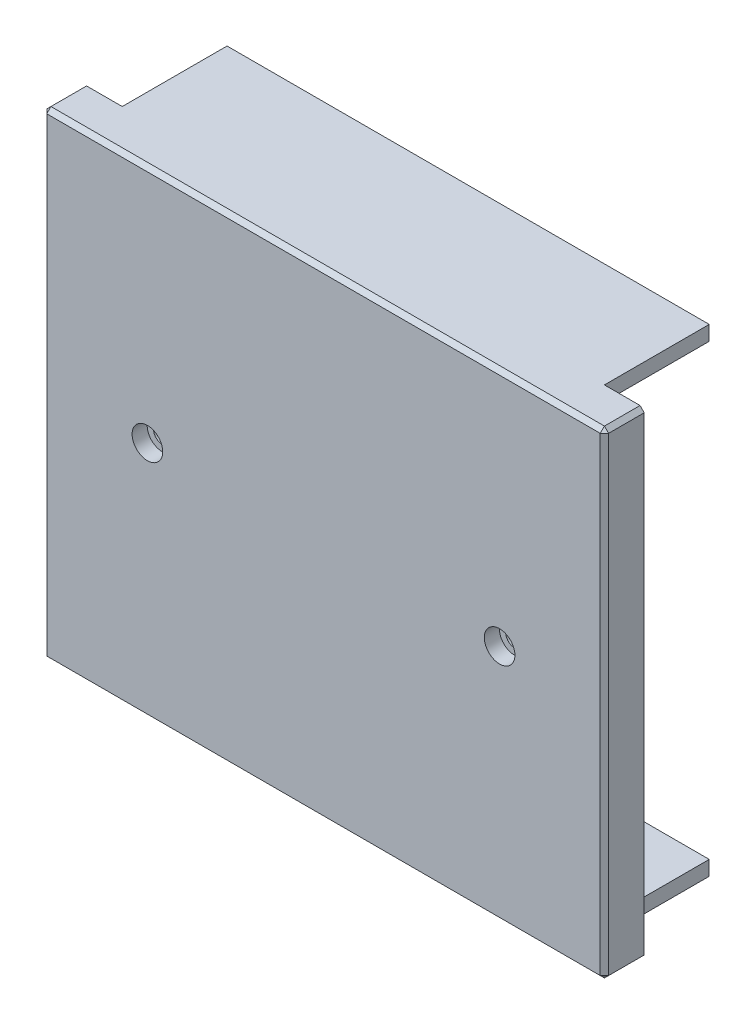
ISO-10303-21;
HEADER;
FILE_DESCRIPTION(('STEP AP214'),'2;1');
FILE_NAME('part.step','',(''),(''),'','','');
FILE_SCHEMA(('AUTOMOTIVE_DESIGN { 1 0 10303 214 1 1 1 1 }'));
ENDSEC;
DATA;
#1=APPLICATION_CONTEXT('core data for automotive mechanical design processes');
#2=APPLICATION_PROTOCOL_DEFINITION('international standard','automotive_design',2000,#1);
#3=PRODUCT_CONTEXT('',#1,'mechanical');
#4=PRODUCT('Part','Part','',(#3));
#5=PRODUCT_RELATED_PRODUCT_CATEGORY('part','',(#4));
#6=PRODUCT_DEFINITION_FORMATION('','',#4);
#7=PRODUCT_DEFINITION_CONTEXT('part definition',#1,'design');
#8=PRODUCT_DEFINITION('design','',#6,#7);
#9=PRODUCT_DEFINITION_SHAPE('','',#8);
#10=(LENGTH_UNIT() NAMED_UNIT(*) SI_UNIT(.MILLI.,.METRE.));
#11=(NAMED_UNIT(*) PLANE_ANGLE_UNIT() SI_UNIT($,.RADIAN.));
#12=(NAMED_UNIT(*) SI_UNIT($,.STERADIAN.) SOLID_ANGLE_UNIT());
#13=UNCERTAINTY_MEASURE_WITH_UNIT(LENGTH_MEASURE(1.E-05),#10,'distance_accuracy_value','');
#14=(GEOMETRIC_REPRESENTATION_CONTEXT(3) GLOBAL_UNCERTAINTY_ASSIGNED_CONTEXT((#13)) GLOBAL_UNIT_ASSIGNED_CONTEXT((#10,
#11,#12)) REPRESENTATION_CONTEXT('',''));
#15=CARTESIAN_POINT('',(0.,0.,0.));
#16=DIRECTION('',(0.,0.,1.));
#17=DIRECTION('',(1.,0.,0.));
#18=AXIS2_PLACEMENT_3D('',#15,#16,#17);
#19=CARTESIAN_POINT('',(109.,57.,-25.));
#20=DIRECTION('',(0.,0.,1.));
#21=DIRECTION('',(1.,0.,0.));
#22=AXIS2_PLACEMENT_3D('',#19,#20,#21);
#23=CYLINDRICAL_SURFACE('',#22,2.15);
#24=CARTESIAN_POINT('',(109.,57.,0.));
#25=DIRECTION('',(0.,0.,-1.));
#26=DIRECTION('',(-1.,0.,0.));
#27=AXIS2_PLACEMENT_3D('',#24,#25,#26);
#28=CIRCLE('',#27,2.15);
#29=CARTESIAN_POINT('',(106.85,57.,0.));
#30=VERTEX_POINT('',#29);
#31=EDGE_CURVE('E237',#30,#30,#28,.T.);
#32=ORIENTED_EDGE('',*,*,#31,.T.);
#33=EDGE_LOOP('',(#32));
#34=FACE_BOUND('',#33,.T.);
#35=CARTESIAN_POINT('',(109.,57.,5.9));
#36=DIRECTION('',(0.,0.,1.));
#37=DIRECTION('',(1.,0.,0.));
#38=AXIS2_PLACEMENT_3D('',#35,#36,#37);
#39=CIRCLE('',#38,2.15);
#40=CARTESIAN_POINT('',(111.15,57.,5.9));
#41=VERTEX_POINT('',#40);
#42=EDGE_CURVE('E233',#41,#41,#39,.F.);
#43=ORIENTED_EDGE('',*,*,#42,.F.);
#44=EDGE_LOOP('',(#43));
#45=FACE_BOUND('',#44,.T.);
#46=ADVANCED_FACE('F33',(#34,#45),#23,.F.);
#47=CARTESIAN_POINT('',(25.,57.,-25.));
#48=DIRECTION('',(0.,0.,1.));
#49=DIRECTION('',(1.,0.,0.));
#50=AXIS2_PLACEMENT_3D('',#47,#48,#49);
#51=CYLINDRICAL_SURFACE('',#50,2.15);
#52=CARTESIAN_POINT('',(25.,57.,0.));
#53=DIRECTION('',(0.,0.,-1.));
#54=DIRECTION('',(-1.,0.,0.));
#55=AXIS2_PLACEMENT_3D('',#52,#53,#54);
#56=CIRCLE('',#55,2.15);
#57=CARTESIAN_POINT('',(22.85,57.,0.));
#58=VERTEX_POINT('',#57);
#59=EDGE_CURVE('E325',#58,#58,#56,.T.);
#60=ORIENTED_EDGE('',*,*,#59,.T.);
#61=EDGE_LOOP('',(#60));
#62=FACE_BOUND('',#61,.T.);
#63=CARTESIAN_POINT('',(25.,57.,5.9));
#64=DIRECTION('',(0.,0.,1.));
#65=DIRECTION('',(1.,0.,0.));
#66=AXIS2_PLACEMENT_3D('',#63,#64,#65);
#67=CIRCLE('',#66,2.15);
#68=CARTESIAN_POINT('',(27.15,57.,5.9));
#69=VERTEX_POINT('',#68);
#70=EDGE_CURVE('E230',#69,#69,#67,.F.);
#71=ORIENTED_EDGE('',*,*,#70,.F.);
#72=EDGE_LOOP('',(#71));
#73=FACE_BOUND('',#72,.T.);
#74=ADVANCED_FACE('F429',(#62,#73),#51,.F.);
#75=CARTESIAN_POINT('',(0.,0.,0.));
#76=DIRECTION('',(0.,0.,-1.));
#77=DIRECTION('',(-1.,0.,0.));
#78=AXIS2_PLACEMENT_3D('',#75,#76,#77);
#79=PLANE('',#78);
#80=ORIENTED_EDGE('',*,*,#59,.F.);
#81=EDGE_LOOP('',(#80));
#82=FACE_BOUND('',#81,.T.);
#83=ORIENTED_EDGE('',*,*,#31,.F.);
#84=EDGE_LOOP('',(#83));
#85=FACE_BOUND('',#84,.T.);
#86=DIRECTION('',(1.,0.,0.));
#87=VECTOR('',#86,1.);
#88=CARTESIAN_POINT('',(0.,0.,0.));
#89=LINE('',#88,#87);
#90=CARTESIAN_POINT('',(0.999999999999973,0.,0.));
#91=VERTEX_POINT('',#90);
#92=CARTESIAN_POINT('',(9.50000000000001,0.,0.));
#93=VERTEX_POINT('',#92);
#94=EDGE_CURVE('E221',#91,#93,#89,.T.);
#95=ORIENTED_EDGE('',*,*,#94,.F.);
#96=DIRECTION('',(0.707106781186548,-0.707106781186548,0.));
#97=VECTOR('',#96,1.);
#98=CARTESIAN_POINT('',(0.499999999999987,0.499999999999987,0.));
#99=LINE('',#98,#97);
#100=CARTESIAN_POINT('',(0.,0.999999999999973,0.));
#101=VERTEX_POINT('',#100);
#102=EDGE_CURVE('E250',#91,#101,#99,.F.);
#103=ORIENTED_EDGE('',*,*,#102,.T.);
#104=DIRECTION('',(0.,-1.,0.));
#105=VECTOR('',#104,1.);
#106=CARTESIAN_POINT('',(0.,0.,0.));
#107=LINE('',#106,#105);
#108=CARTESIAN_POINT('',(0.,113.,0.));
#109=VERTEX_POINT('',#108);
#110=EDGE_CURVE('E217',#109,#101,#107,.T.);
#111=ORIENTED_EDGE('',*,*,#110,.F.);
#112=DIRECTION('',(-0.707106781186548,-0.707106781186548,0.));
#113=VECTOR('',#112,1.);
#114=CARTESIAN_POINT('',(-56.5,56.5,0.));
#115=LINE('',#114,#113);
#116=CARTESIAN_POINT('',(0.999999999999973,114.,0.));
#117=VERTEX_POINT('',#116);
#118=EDGE_CURVE('E248',#109,#117,#115,.F.);
#119=ORIENTED_EDGE('',*,*,#118,.T.);
#120=DIRECTION('',(-1.,0.,0.));
#121=VECTOR('',#120,1.);
#122=CARTESIAN_POINT('',(0.,114.,0.));
#123=LINE('',#122,#121);
#124=CARTESIAN_POINT('',(9.50000000000001,114.,0.));
#125=VERTEX_POINT('',#124);
#126=EDGE_CURVE('E226',#125,#117,#123,.T.);
#127=ORIENTED_EDGE('',*,*,#126,.F.);
#128=DIRECTION('',(0.,1.,0.));
#129=VECTOR('',#128,1.);
#130=CARTESIAN_POINT('',(9.50000000000001,110.5,0.));
#131=LINE('',#130,#129);
#132=CARTESIAN_POINT('',(9.50000000000001,110.5,0.));
#133=VERTEX_POINT('',#132);
#134=EDGE_CURVE('E195',#133,#125,#131,.T.);
#135=ORIENTED_EDGE('',*,*,#134,.F.);
#136=DIRECTION('',(-1.,0.,0.));
#137=VECTOR('',#136,1.);
#138=CARTESIAN_POINT('',(124.5,110.5,0.));
#139=LINE('',#138,#137);
#140=CARTESIAN_POINT('',(124.5,110.5,0.));
#141=VERTEX_POINT('',#140);
#142=EDGE_CURVE('E186',#141,#133,#139,.T.);
#143=ORIENTED_EDGE('',*,*,#142,.F.);
#144=DIRECTION('',(0.,-1.,0.));
#145=VECTOR('',#144,1.);
#146=CARTESIAN_POINT('',(124.5,114.,0.));
#147=LINE('',#146,#145);
#148=CARTESIAN_POINT('',(124.5,114.,0.));
#149=VERTEX_POINT('',#148);
#150=EDGE_CURVE('E183',#149,#141,#147,.T.);
#151=ORIENTED_EDGE('',*,*,#150,.F.);
#152=CARTESIAN_POINT('',(133.,114.,0.));
#153=VERTEX_POINT('',#152);
#154=EDGE_CURVE('E227',#153,#149,#123,.T.);
#155=ORIENTED_EDGE('',*,*,#154,.F.);
#156=DIRECTION('',(-0.707106781186548,0.707106781186548,0.));
#157=VECTOR('',#156,1.);
#158=CARTESIAN_POINT('',(123.5,123.5,0.));
#159=LINE('',#158,#157);
#160=CARTESIAN_POINT('',(134.,113.,0.));
#161=VERTEX_POINT('',#160);
#162=EDGE_CURVE('E246',#153,#161,#159,.F.);
#163=ORIENTED_EDGE('',*,*,#162,.T.);
#164=DIRECTION('',(0.,1.,0.));
#165=VECTOR('',#164,1.);
#166=CARTESIAN_POINT('',(134.,0.,0.));
#167=LINE('',#166,#165);
#168=CARTESIAN_POINT('',(134.,0.999999999999973,0.));
#169=VERTEX_POINT('',#168);
#170=EDGE_CURVE('E223',#169,#161,#167,.T.);
#171=ORIENTED_EDGE('',*,*,#170,.F.);
#172=DIRECTION('',(0.707106781186548,0.707106781186548,0.));
#173=VECTOR('',#172,1.);
#174=CARTESIAN_POINT('',(66.5,-66.5,0.));
#175=LINE('',#174,#173);
#176=CARTESIAN_POINT('',(133.,0.,0.));
#177=VERTEX_POINT('',#176);
#178=EDGE_CURVE('E244',#169,#177,#175,.F.);
#179=ORIENTED_EDGE('',*,*,#178,.T.);
#180=CARTESIAN_POINT('',(124.5,0.,0.));
#181=VERTEX_POINT('',#180);
#182=EDGE_CURVE('E220',#181,#177,#89,.T.);
#183=ORIENTED_EDGE('',*,*,#182,.F.);
#184=DIRECTION('',(0.,-1.,0.));
#185=VECTOR('',#184,1.);
#186=CARTESIAN_POINT('',(124.5,0.,0.));
#187=LINE('',#186,#185);
#188=CARTESIAN_POINT('',(124.5,3.49999999999998,0.));
#189=VERTEX_POINT('',#188);
#190=EDGE_CURVE('E181',#189,#181,#187,.T.);
#191=ORIENTED_EDGE('',*,*,#190,.F.);
#192=DIRECTION('',(1.,0.,0.));
#193=VECTOR('',#192,1.);
#194=CARTESIAN_POINT('',(124.5,3.49999999999998,0.));
#195=LINE('',#194,#193);
#196=CARTESIAN_POINT('',(9.50000000000001,3.49999999999998,0.));
#197=VERTEX_POINT('',#196);
#198=EDGE_CURVE('E177',#197,#189,#195,.T.);
#199=ORIENTED_EDGE('',*,*,#198,.F.);
#200=DIRECTION('',(0.,1.,0.));
#201=VECTOR('',#200,1.);
#202=CARTESIAN_POINT('',(9.50000000000001,0.,0.));
#203=LINE('',#202,#201);
#204=EDGE_CURVE('E332',#93,#197,#203,.T.);
#205=ORIENTED_EDGE('',*,*,#204,.F.);
#206=EDGE_LOOP('',(#95,#103,#111,#119,#127,#135,#143,#151,#155,#163,#171,#179,#183,#191,#199,#205));
#207=FACE_BOUND('',#206,.T.);
#208=ADVANCED_FACE('F345',(#82,#85,#207),#79,.T.);
#209=CARTESIAN_POINT('',(0.,0.,9.5));
#210=DIRECTION('',(1.,0.,0.));
#211=DIRECTION('',(0.,0.,-1.));
#212=AXIS2_PLACEMENT_3D('',#209,#210,#211);
#213=PLANE('',#212);
#214=ORIENTED_EDGE('',*,*,#110,.T.);
#215=DIRECTION('',(0.,0.,1.));
#216=VECTOR('',#215,1.);
#217=CARTESIAN_POINT('',(0.,0.999999999999973,9.5));
#218=LINE('',#217,#216);
#219=CARTESIAN_POINT('',(0.,0.999999999999973,8.50000000000003));
#220=VERTEX_POINT('',#219);
#221=EDGE_CURVE('E256',#101,#220,#218,.T.);
#222=ORIENTED_EDGE('',*,*,#221,.T.);
#223=DIRECTION('',(0.,1.,0.));
#224=VECTOR('',#223,1.);
#225=CARTESIAN_POINT('',(0.,0.,8.50000000000003));
#226=LINE('',#225,#224);
#227=CARTESIAN_POINT('',(0.,113.,8.50000000000003));
#228=VERTEX_POINT('',#227);
#229=EDGE_CURVE('E252',#220,#228,#226,.T.);
#230=ORIENTED_EDGE('',*,*,#229,.T.);
#231=DIRECTION('',(0.,0.,-1.));
#232=VECTOR('',#231,1.);
#233=CARTESIAN_POINT('',(0.,113.,9.5));
#234=LINE('',#233,#232);
#235=EDGE_CURVE('E254',#228,#109,#234,.T.);
#236=ORIENTED_EDGE('',*,*,#235,.T.);
#237=EDGE_LOOP('',(#214,#222,#230,#236));
#238=FACE_BOUND('',#237,.T.);
#239=ADVANCED_FACE('F368',(#238),#213,.F.);
#240=CARTESIAN_POINT('',(0.,0.,9.5));
#241=DIRECTION('',(0.,1.,0.));
#242=DIRECTION('',(0.,0.,1.));
#243=AXIS2_PLACEMENT_3D('',#240,#241,#242);
#244=PLANE('',#243);
#245=DIRECTION('',(-1.,0.,0.));
#246=VECTOR('',#245,1.);
#247=CARTESIAN_POINT('',(0.,0.,8.50000000000003));
#248=LINE('',#247,#246);
#249=CARTESIAN_POINT('',(133.,0.,8.50000000000003));
#250=VERTEX_POINT('',#249);
#251=CARTESIAN_POINT('',(0.999999999999973,0.,8.50000000000003));
#252=VERTEX_POINT('',#251);
#253=EDGE_CURVE('E229',#250,#252,#248,.T.);
#254=ORIENTED_EDGE('',*,*,#253,.T.);
#255=DIRECTION('',(0.,0.,-1.));
#256=VECTOR('',#255,1.);
#257=CARTESIAN_POINT('',(0.999999999999973,0.,9.5));
#258=LINE('',#257,#256);
#259=EDGE_CURVE('E241',#252,#91,#258,.T.);
#260=ORIENTED_EDGE('',*,*,#259,.T.);
#261=ORIENTED_EDGE('',*,*,#94,.T.);
#262=DIRECTION('',(0.,0.,1.));
#263=VECTOR('',#262,1.);
#264=CARTESIAN_POINT('',(9.50000000000001,0.,-25.));
#265=LINE('',#264,#263);
#266=CARTESIAN_POINT('',(9.50000000000001,0.,-25.));
#267=VERTEX_POINT('',#266);
#268=EDGE_CURVE('E164',#267,#93,#265,.T.);
#269=ORIENTED_EDGE('',*,*,#268,.F.);
#270=DIRECTION('',(-1.,0.,0.));
#271=VECTOR('',#270,1.);
#272=CARTESIAN_POINT('',(124.5,0.,-25.));
#273=LINE('',#272,#271);
#274=CARTESIAN_POINT('',(124.5,0.,-25.));
#275=VERTEX_POINT('',#274);
#276=EDGE_CURVE('E156',#275,#267,#273,.T.);
#277=ORIENTED_EDGE('',*,*,#276,.F.);
#278=DIRECTION('',(0.,0.,1.));
#279=VECTOR('',#278,1.);
#280=CARTESIAN_POINT('',(124.5,0.,-25.));
#281=LINE('',#280,#279);
#282=EDGE_CURVE('E161',#275,#181,#281,.T.);
#283=ORIENTED_EDGE('',*,*,#282,.T.);
#284=ORIENTED_EDGE('',*,*,#182,.T.);
#285=DIRECTION('',(0.,0.,1.));
#286=VECTOR('',#285,1.);
#287=CARTESIAN_POINT('',(133.,0.,9.5));
#288=LINE('',#287,#286);
#289=EDGE_CURVE('E239',#177,#250,#288,.T.);
#290=ORIENTED_EDGE('',*,*,#289,.T.);
#291=EDGE_LOOP('',(#254,#260,#261,#269,#277,#283,#284,#290));
#292=FACE_BOUND('',#291,.T.);
#293=ADVANCED_FACE('F158',(#292),#244,.F.);
#294=CARTESIAN_POINT('',(134.,0.,9.5));
#295=DIRECTION('',(-1.,0.,0.));
#296=DIRECTION('',(0.,0.,1.));
#297=AXIS2_PLACEMENT_3D('',#294,#295,#296);
#298=PLANE('',#297);
#299=ORIENTED_EDGE('',*,*,#170,.T.);
#300=DIRECTION('',(0.,0.,1.));
#301=VECTOR('',#300,1.);
#302=CARTESIAN_POINT('',(134.,113.,9.5));
#303=LINE('',#302,#301);
#304=CARTESIAN_POINT('',(134.,113.,8.50000000000003));
#305=VERTEX_POINT('',#304);
#306=EDGE_CURVE('E268',#161,#305,#303,.T.);
#307=ORIENTED_EDGE('',*,*,#306,.T.);
#308=DIRECTION('',(0.,-1.,0.));
#309=VECTOR('',#308,1.);
#310=CARTESIAN_POINT('',(134.,0.,8.50000000000003));
#311=LINE('',#310,#309);
#312=CARTESIAN_POINT('',(134.,0.999999999999973,8.50000000000003));
#313=VERTEX_POINT('',#312);
#314=EDGE_CURVE('E264',#305,#313,#311,.T.);
#315=ORIENTED_EDGE('',*,*,#314,.T.);
#316=DIRECTION('',(0.,0.,-1.));
#317=VECTOR('',#316,1.);
#318=CARTESIAN_POINT('',(134.,0.999999999999973,9.5));
#319=LINE('',#318,#317);
#320=EDGE_CURVE('E266',#313,#169,#319,.T.);
#321=ORIENTED_EDGE('',*,*,#320,.T.);
#322=EDGE_LOOP('',(#299,#307,#315,#321));
#323=FACE_BOUND('',#322,.T.);
#324=ADVANCED_FACE('F396',(#323),#298,.F.);
#325=CARTESIAN_POINT('',(0.,114.,9.5));
#326=DIRECTION('',(0.,-1.,0.));
#327=DIRECTION('',(0.,0.,-1.));
#328=AXIS2_PLACEMENT_3D('',#325,#326,#327);
#329=PLANE('',#328);
#330=ORIENTED_EDGE('',*,*,#126,.T.);
#331=DIRECTION('',(0.,0.,1.));
#332=VECTOR('',#331,1.);
#333=CARTESIAN_POINT('',(0.999999999999973,114.,9.5));
#334=LINE('',#333,#332);
#335=CARTESIAN_POINT('',(0.999999999999973,114.,8.50000000000003));
#336=VERTEX_POINT('',#335);
#337=EDGE_CURVE('E262',#117,#336,#334,.T.);
#338=ORIENTED_EDGE('',*,*,#337,.T.);
#339=DIRECTION('',(1.,0.,0.));
#340=VECTOR('',#339,1.);
#341=CARTESIAN_POINT('',(0.,114.,8.50000000000003));
#342=LINE('',#341,#340);
#343=CARTESIAN_POINT('',(133.,114.,8.50000000000003));
#344=VERTEX_POINT('',#343);
#345=EDGE_CURVE('E258',#336,#344,#342,.T.);
#346=ORIENTED_EDGE('',*,*,#345,.T.);
#347=DIRECTION('',(0.,0.,-1.));
#348=VECTOR('',#347,1.);
#349=CARTESIAN_POINT('',(133.,114.,9.5));
#350=LINE('',#349,#348);
#351=EDGE_CURVE('E260',#344,#153,#350,.T.);
#352=ORIENTED_EDGE('',*,*,#351,.T.);
#353=ORIENTED_EDGE('',*,*,#154,.T.);
#354=DIRECTION('',(0.,0.,1.));
#355=VECTOR('',#354,1.);
#356=CARTESIAN_POINT('',(124.5,114.,-25.));
#357=LINE('',#356,#355);
#358=CARTESIAN_POINT('',(124.5,114.,-25.));
#359=VERTEX_POINT('',#358);
#360=EDGE_CURVE('E214',#359,#149,#357,.T.);
#361=ORIENTED_EDGE('',*,*,#360,.F.);
#362=DIRECTION('',(1.,0.,0.));
#363=VECTOR('',#362,1.);
#364=CARTESIAN_POINT('',(9.50000000000002,114.,-25.));
#365=LINE('',#364,#363);
#366=CARTESIAN_POINT('',(9.50000000000002,114.,-25.));
#367=VERTEX_POINT('',#366);
#368=EDGE_CURVE('E192',#367,#359,#365,.T.);
#369=ORIENTED_EDGE('',*,*,#368,.F.);
#370=DIRECTION('',(0.,0.,1.));
#371=VECTOR('',#370,1.);
#372=CARTESIAN_POINT('',(9.50000000000002,114.,-25.));
#373=LINE('',#372,#371);
#374=EDGE_CURVE('E200',#367,#125,#373,.T.);
#375=ORIENTED_EDGE('',*,*,#374,.T.);
#376=EDGE_LOOP('',(#330,#338,#346,#352,#353,#361,#369,#375));
#377=FACE_BOUND('',#376,.T.);
#378=ADVANCED_FACE('F389',(#377),#329,.F.);
#379=CARTESIAN_POINT('',(0.,0.,9.5));
#380=DIRECTION('',(0.,0.,-1.));
#381=DIRECTION('',(-1.,0.,0.));
#382=AXIS2_PLACEMENT_3D('',#379,#380,#381);
#383=PLANE('',#382);
#384=DIRECTION('',(1.,0.,0.));
#385=VECTOR('',#384,1.);
#386=CARTESIAN_POINT('',(0.,0.999999999999973,9.5));
#387=LINE('',#386,#385);
#388=CARTESIAN_POINT('',(0.999999999999973,0.999999999999973,9.5));
#389=VERTEX_POINT('',#388);
#390=CARTESIAN_POINT('',(133.,0.999999999999973,9.5));
#391=VERTEX_POINT('',#390);
#392=EDGE_CURVE('E42',#389,#391,#387,.T.);
#393=ORIENTED_EDGE('',*,*,#392,.T.);
#394=DIRECTION('',(0.,1.,0.));
#395=VECTOR('',#394,1.);
#396=CARTESIAN_POINT('',(133.,0.,9.5));
#397=LINE('',#396,#395);
#398=CARTESIAN_POINT('',(133.,113.,9.5));
#399=VERTEX_POINT('',#398);
#400=EDGE_CURVE('E11',#391,#399,#397,.T.);
#401=ORIENTED_EDGE('',*,*,#400,.T.);
#402=DIRECTION('',(-1.,0.,0.));
#403=VECTOR('',#402,1.);
#404=CARTESIAN_POINT('',(0.,113.,9.5));
#405=LINE('',#404,#403);
#406=CARTESIAN_POINT('',(0.999999999999973,113.,9.5));
#407=VERTEX_POINT('',#406);
#408=EDGE_CURVE('E270',#399,#407,#405,.T.);
#409=ORIENTED_EDGE('',*,*,#408,.T.);
#410=DIRECTION('',(0.,-1.,0.));
#411=VECTOR('',#410,1.);
#412=CARTESIAN_POINT('',(0.999999999999973,0.,9.5));
#413=LINE('',#412,#411);
#414=EDGE_CURVE('E53',#407,#389,#413,.T.);
#415=ORIENTED_EDGE('',*,*,#414,.T.);
#416=EDGE_LOOP('',(#393,#401,#409,#415));
#417=FACE_BOUND('',#416,.T.);
#418=CARTESIAN_POINT('',(25.,57.,9.5));
#419=DIRECTION('',(0.,0.,1.));
#420=DIRECTION('',(1.,0.,0.));
#421=AXIS2_PLACEMENT_3D('',#418,#419,#420);
#422=CIRCLE('',#421,3.65);
#423=CARTESIAN_POINT('',(28.65,57.,9.5));
#424=VERTEX_POINT('',#423);
#425=EDGE_CURVE('E319',#424,#424,#422,.T.);
#426=ORIENTED_EDGE('',*,*,#425,.F.);
#427=EDGE_LOOP('',(#426));
#428=FACE_BOUND('',#427,.T.);
#429=CARTESIAN_POINT('',(109.,57.,9.5));
#430=DIRECTION('',(0.,0.,1.));
#431=DIRECTION('',(1.,0.,0.));
#432=AXIS2_PLACEMENT_3D('',#429,#430,#431);
#433=CIRCLE('',#432,3.65);
#434=CARTESIAN_POINT('',(112.65,57.,9.5));
#435=VERTEX_POINT('',#434);
#436=EDGE_CURVE('E309',#435,#435,#433,.T.);
#437=ORIENTED_EDGE('',*,*,#436,.F.);
#438=EDGE_LOOP('',(#437));
#439=FACE_BOUND('',#438,.T.);
#440=ADVANCED_FACE('F400',(#417,#428,#439),#383,.F.);
#441=CARTESIAN_POINT('',(124.5,114.,-25.));
#442=DIRECTION('',(-1.,0.,0.));
#443=DIRECTION('',(0.,0.,1.));
#444=AXIS2_PLACEMENT_3D('',#441,#442,#443);
#445=PLANE('',#444);
#446=ORIENTED_EDGE('',*,*,#150,.T.);
#447=DIRECTION('',(0.,0.,1.));
#448=VECTOR('',#447,1.);
#449=CARTESIAN_POINT('',(124.5,110.5,-25.));
#450=LINE('',#449,#448);
#451=CARTESIAN_POINT('',(124.5,110.5,-25.));
#452=VERTEX_POINT('',#451);
#453=EDGE_CURVE('E211',#452,#141,#450,.T.);
#454=ORIENTED_EDGE('',*,*,#453,.F.);
#455=DIRECTION('',(0.,-1.,0.));
#456=VECTOR('',#455,1.);
#457=CARTESIAN_POINT('',(124.5,114.,-25.));
#458=LINE('',#457,#456);
#459=EDGE_CURVE('E194',#359,#452,#458,.T.);
#460=ORIENTED_EDGE('',*,*,#459,.F.);
#461=ORIENTED_EDGE('',*,*,#360,.T.);
#462=EDGE_LOOP('',(#446,#454,#460,#461));
#463=FACE_BOUND('',#462,.T.);
#464=ADVANCED_FACE('F403',(#463),#445,.F.);
#465=CARTESIAN_POINT('',(124.5,110.5,-25.));
#466=DIRECTION('',(0.,1.,0.));
#467=DIRECTION('',(0.,0.,1.));
#468=AXIS2_PLACEMENT_3D('',#465,#466,#467);
#469=PLANE('',#468);
#470=ORIENTED_EDGE('',*,*,#142,.T.);
#471=DIRECTION('',(0.,0.,1.));
#472=VECTOR('',#471,1.);
#473=CARTESIAN_POINT('',(9.50000000000001,110.5,-25.));
#474=LINE('',#473,#472);
#475=CARTESIAN_POINT('',(9.50000000000001,110.5,-25.));
#476=VERTEX_POINT('',#475);
#477=EDGE_CURVE('E208',#476,#133,#474,.T.);
#478=ORIENTED_EDGE('',*,*,#477,.F.);
#479=DIRECTION('',(-1.,0.,0.));
#480=VECTOR('',#479,1.);
#481=CARTESIAN_POINT('',(124.5,110.5,-25.));
#482=LINE('',#481,#480);
#483=EDGE_CURVE('E197',#452,#476,#482,.T.);
#484=ORIENTED_EDGE('',*,*,#483,.F.);
#485=ORIENTED_EDGE('',*,*,#453,.T.);
#486=EDGE_LOOP('',(#470,#478,#484,#485));
#487=FACE_BOUND('',#486,.T.);
#488=ADVANCED_FACE('F455',(#487),#469,.F.);
#489=CARTESIAN_POINT('',(9.50000000000001,110.5,-25.));
#490=DIRECTION('',(1.,0.,0.));
#491=DIRECTION('',(0.,1.,0.));
#492=AXIS2_PLACEMENT_3D('',#489,#490,#491);
#493=PLANE('',#492);
#494=ORIENTED_EDGE('',*,*,#134,.T.);
#495=ORIENTED_EDGE('',*,*,#374,.F.);
#496=DIRECTION('',(0.,1.,0.));
#497=VECTOR('',#496,1.);
#498=CARTESIAN_POINT('',(9.50000000000001,110.5,-25.));
#499=LINE('',#498,#497);
#500=EDGE_CURVE('E199',#476,#367,#499,.T.);
#501=ORIENTED_EDGE('',*,*,#500,.F.);
#502=ORIENTED_EDGE('',*,*,#477,.T.);
#503=EDGE_LOOP('',(#494,#495,#501,#502));
#504=FACE_BOUND('',#503,.T.);
#505=ADVANCED_FACE('F451',(#504),#493,.F.);
#506=CARTESIAN_POINT('',(0.,0.,-25.));
#507=DIRECTION('',(0.,0.,-1.));
#508=DIRECTION('',(-1.,0.,0.));
#509=AXIS2_PLACEMENT_3D('',#506,#507,#508);
#510=PLANE('',#509);
#511=ORIENTED_EDGE('',*,*,#368,.T.);
#512=ORIENTED_EDGE('',*,*,#459,.T.);
#513=ORIENTED_EDGE('',*,*,#483,.T.);
#514=ORIENTED_EDGE('',*,*,#500,.T.);
#515=EDGE_LOOP('',(#511,#512,#513,#514));
#516=FACE_BOUND('',#515,.T.);
#517=ADVANCED_FACE('F448',(#516),#510,.T.);
#518=CARTESIAN_POINT('',(124.5,0.,-25.));
#519=DIRECTION('',(-1.,0.,0.));
#520=DIRECTION('',(0.,0.,1.));
#521=AXIS2_PLACEMENT_3D('',#518,#519,#520);
#522=PLANE('',#521);
#523=ORIENTED_EDGE('',*,*,#190,.T.);
#524=ORIENTED_EDGE('',*,*,#282,.F.);
#525=DIRECTION('',(0.,-1.,0.));
#526=VECTOR('',#525,1.);
#527=CARTESIAN_POINT('',(124.5,0.,-25.));
#528=LINE('',#527,#526);
#529=CARTESIAN_POINT('',(124.5,3.49999999999998,-25.));
#530=VERTEX_POINT('',#529);
#531=EDGE_CURVE('E168',#530,#275,#528,.T.);
#532=ORIENTED_EDGE('',*,*,#531,.F.);
#533=DIRECTION('',(0.,0.,1.));
#534=VECTOR('',#533,1.);
#535=CARTESIAN_POINT('',(124.5,3.49999999999998,-25.));
#536=LINE('',#535,#534);
#537=EDGE_CURVE('E330',#530,#189,#536,.T.);
#538=ORIENTED_EDGE('',*,*,#537,.T.);
#539=EDGE_LOOP('',(#523,#524,#532,#538));
#540=FACE_BOUND('',#539,.T.);
#541=ADVANCED_FACE('F179',(#540),#522,.F.);
#542=CARTESIAN_POINT('',(9.50000000000001,0.,-25.));
#543=DIRECTION('',(1.,0.,0.));
#544=DIRECTION('',(0.,1.,0.));
#545=AXIS2_PLACEMENT_3D('',#542,#543,#544);
#546=PLANE('',#545);
#547=ORIENTED_EDGE('',*,*,#204,.T.);
#548=DIRECTION('',(0.,0.,1.));
#549=VECTOR('',#548,1.);
#550=CARTESIAN_POINT('',(9.50000000000001,3.49999999999998,-25.));
#551=LINE('',#550,#549);
#552=CARTESIAN_POINT('',(9.50000000000001,3.49999999999998,-25.));
#553=VERTEX_POINT('',#552);
#554=EDGE_CURVE('E188',#553,#197,#551,.T.);
#555=ORIENTED_EDGE('',*,*,#554,.F.);
#556=DIRECTION('',(0.,1.,0.));
#557=VECTOR('',#556,1.);
#558=CARTESIAN_POINT('',(9.50000000000001,0.,-25.));
#559=LINE('',#558,#557);
#560=EDGE_CURVE('E167',#267,#553,#559,.T.);
#561=ORIENTED_EDGE('',*,*,#560,.F.);
#562=ORIENTED_EDGE('',*,*,#268,.T.);
#563=EDGE_LOOP('',(#547,#555,#561,#562));
#564=FACE_BOUND('',#563,.T.);
#565=ADVANCED_FACE('F342',(#564),#546,.F.);
#566=CARTESIAN_POINT('',(124.5,3.49999999999998,-25.));
#567=DIRECTION('',(0.,-1.,0.));
#568=DIRECTION('',(0.,0.,-1.));
#569=AXIS2_PLACEMENT_3D('',#566,#567,#568);
#570=PLANE('',#569);
#571=ORIENTED_EDGE('',*,*,#198,.T.);
#572=ORIENTED_EDGE('',*,*,#537,.F.);
#573=DIRECTION('',(1.,0.,0.));
#574=VECTOR('',#573,1.);
#575=CARTESIAN_POINT('',(124.5,3.49999999999998,-25.));
#576=LINE('',#575,#574);
#577=EDGE_CURVE('E173',#553,#530,#576,.T.);
#578=ORIENTED_EDGE('',*,*,#577,.F.);
#579=ORIENTED_EDGE('',*,*,#554,.T.);
#580=EDGE_LOOP('',(#571,#572,#578,#579));
#581=FACE_BOUND('',#580,.T.);
#582=ADVANCED_FACE('F338',(#581),#570,.F.);
#583=CARTESIAN_POINT('',(0.,0.,-25.));
#584=DIRECTION('',(0.,0.,1.));
#585=DIRECTION('',(1.,0.,0.));
#586=AXIS2_PLACEMENT_3D('',#583,#584,#585);
#587=PLANE('',#586);
#588=ORIENTED_EDGE('',*,*,#531,.T.);
#589=ORIENTED_EDGE('',*,*,#276,.T.);
#590=ORIENTED_EDGE('',*,*,#560,.T.);
#591=ORIENTED_EDGE('',*,*,#577,.T.);
#592=EDGE_LOOP('',(#588,#589,#590,#591));
#593=FACE_BOUND('',#592,.T.);
#594=ADVANCED_FACE('F171',(#593),#587,.F.);
#595=CARTESIAN_POINT('',(25.,57.,5.9));
#596=DIRECTION('',(0.,0.,1.));
#597=DIRECTION('',(1.,0.,0.));
#598=AXIS2_PLACEMENT_3D('',#595,#596,#597);
#599=PLANE('',#598);
#600=CARTESIAN_POINT('',(25.,57.,5.9));
#601=DIRECTION('',(0.,0.,1.));
#602=DIRECTION('',(1.,0.,0.));
#603=AXIS2_PLACEMENT_3D('',#600,#601,#602);
#604=CIRCLE('',#603,3.65);
#605=CARTESIAN_POINT('',(28.65,57.,5.9));
#606=VERTEX_POINT('',#605);
#607=EDGE_CURVE('E234',#606,#606,#604,.T.);
#608=ORIENTED_EDGE('',*,*,#607,.T.);
#609=EDGE_LOOP('',(#608));
#610=FACE_BOUND('',#609,.T.);
#611=ORIENTED_EDGE('',*,*,#70,.T.);
#612=EDGE_LOOP('',(#611));
#613=FACE_BOUND('',#612,.T.);
#614=ADVANCED_FACE('F413',(#610,#613),#599,.T.);
#615=CARTESIAN_POINT('',(25.,57.,5.9));
#616=DIRECTION('',(0.,0.,1.));
#617=DIRECTION('',(1.,0.,0.));
#618=AXIS2_PLACEMENT_3D('',#615,#616,#617);
#619=CYLINDRICAL_SURFACE('',#618,3.65);
#620=ORIENTED_EDGE('',*,*,#607,.F.);
#621=EDGE_LOOP('',(#620));
#622=FACE_BOUND('',#621,.T.);
#623=ORIENTED_EDGE('',*,*,#425,.T.);
#624=EDGE_LOOP('',(#623));
#625=FACE_BOUND('',#624,.T.);
#626=ADVANCED_FACE('F416',(#622,#625),#619,.F.);
#627=CARTESIAN_POINT('',(109.,57.,5.9));
#628=DIRECTION('',(0.,0.,1.));
#629=DIRECTION('',(1.,0.,0.));
#630=AXIS2_PLACEMENT_3D('',#627,#628,#629);
#631=PLANE('',#630);
#632=CARTESIAN_POINT('',(109.,57.,5.9));
#633=DIRECTION('',(0.,0.,1.));
#634=DIRECTION('',(1.,0.,0.));
#635=AXIS2_PLACEMENT_3D('',#632,#633,#634);
#636=CIRCLE('',#635,3.65);
#637=CARTESIAN_POINT('',(112.65,57.,5.9));
#638=VERTEX_POINT('',#637);
#639=EDGE_CURVE('E314',#638,#638,#636,.T.);
#640=ORIENTED_EDGE('',*,*,#639,.T.);
#641=EDGE_LOOP('',(#640));
#642=FACE_BOUND('',#641,.T.);
#643=ORIENTED_EDGE('',*,*,#42,.T.);
#644=EDGE_LOOP('',(#643));
#645=FACE_BOUND('',#644,.T.);
#646=ADVANCED_FACE('F418',(#642,#645),#631,.T.);
#647=CARTESIAN_POINT('',(109.,57.,5.9));
#648=DIRECTION('',(0.,0.,1.));
#649=DIRECTION('',(1.,0.,0.));
#650=AXIS2_PLACEMENT_3D('',#647,#648,#649);
#651=CYLINDRICAL_SURFACE('',#650,3.65);
#652=ORIENTED_EDGE('',*,*,#639,.F.);
#653=EDGE_LOOP('',(#652));
#654=FACE_BOUND('',#653,.T.);
#655=ORIENTED_EDGE('',*,*,#436,.T.);
#656=EDGE_LOOP('',(#655));
#657=FACE_BOUND('',#656,.T.);
#658=ADVANCED_FACE('F424',(#654,#657),#651,.F.);
#659=CARTESIAN_POINT('',(133.,114.,9.5));
#660=DIRECTION('',(-0.707106781186548,-0.707106781186548,0.));
#661=DIRECTION('',(0.,0.,-1.));
#662=AXIS2_PLACEMENT_3D('',#659,#660,#661);
#663=PLANE('',#662);
#664=DIRECTION('',(0.707106781186547,-0.707106781186547,0.));
#665=VECTOR('',#664,1.);
#666=CARTESIAN_POINT('',(134.,113.,8.50000000000003));
#667=LINE('',#666,#665);
#668=EDGE_CURVE('E37',#305,#344,#667,.F.);
#669=ORIENTED_EDGE('',*,*,#668,.F.);
#670=ORIENTED_EDGE('',*,*,#306,.F.);
#671=ORIENTED_EDGE('',*,*,#162,.F.);
#672=ORIENTED_EDGE('',*,*,#351,.F.);
#673=EDGE_LOOP('',(#669,#670,#671,#672));
#674=FACE_BOUND('',#673,.T.);
#675=ADVANCED_FACE('F35',(#674),#663,.F.);
#676=CARTESIAN_POINT('',(134.,113.,8.50000000000003));
#677=DIRECTION('',(0.577350269189626,0.577350269189626,0.577350269189626));
#678=DIRECTION('',(0.707106781186548,0.,-0.707106781186548));
#679=AXIS2_PLACEMENT_3D('',#676,#677,#678);
#680=PLANE('',#679);
#681=DIRECTION('',(-0.707106781186547,0.,0.707106781186547));
#682=VECTOR('',#681,1.);
#683=CARTESIAN_POINT('',(134.,113.,8.50000000000003));
#684=LINE('',#683,#682);
#685=EDGE_CURVE('E301',#305,#399,#684,.T.);
#686=ORIENTED_EDGE('',*,*,#685,.F.);
#687=ORIENTED_EDGE('',*,*,#668,.T.);
#688=DIRECTION('',(0.,0.707106781186547,-0.707106781186547));
#689=VECTOR('',#688,1.);
#690=CARTESIAN_POINT('',(133.,113.5,9.00000000000001));
#691=LINE('',#690,#689);
#692=EDGE_CURVE('E303',#399,#344,#691,.T.);
#693=ORIENTED_EDGE('',*,*,#692,.F.);
#694=EDGE_LOOP('',(#686,#687,#693));
#695=FACE_BOUND('',#694,.T.);
#696=ADVANCED_FACE('F493',(#695),#680,.T.);
#697=CARTESIAN_POINT('',(0.,113.,9.5));
#698=DIRECTION('',(0.707106781186548,-0.707106781186548,0.));
#699=DIRECTION('',(0.,0.,-1.));
#700=AXIS2_PLACEMENT_3D('',#697,#698,#699);
#701=PLANE('',#700);
#702=ORIENTED_EDGE('',*,*,#118,.F.);
#703=ORIENTED_EDGE('',*,*,#235,.F.);
#704=DIRECTION('',(0.707106781186547,0.707106781186547,0.));
#705=VECTOR('',#704,1.);
#706=CARTESIAN_POINT('',(0.999999999999973,114.,8.50000000000003));
#707=LINE('',#706,#705);
#708=EDGE_CURVE('E298',#336,#228,#707,.F.);
#709=ORIENTED_EDGE('',*,*,#708,.F.);
#710=ORIENTED_EDGE('',*,*,#337,.F.);
#711=EDGE_LOOP('',(#702,#703,#709,#710));
#712=FACE_BOUND('',#711,.T.);
#713=ADVANCED_FACE('F380',(#712),#701,.F.);
#714=CARTESIAN_POINT('',(0.,113.,9.5));
#715=DIRECTION('',(0.,-0.707106781186548,-0.707106781186548));
#716=DIRECTION('',(-1.,0.,0.));
#717=AXIS2_PLACEMENT_3D('',#714,#715,#716);
#718=PLANE('',#717);
#719=ORIENTED_EDGE('',*,*,#692,.T.);
#720=ORIENTED_EDGE('',*,*,#345,.F.);
#721=DIRECTION('',(0.,-0.707106781186547,0.707106781186547));
#722=VECTOR('',#721,1.);
#723=CARTESIAN_POINT('',(0.999999999999973,114.,8.50000000000003));
#724=LINE('',#723,#722);
#725=EDGE_CURVE('E295',#407,#336,#724,.F.);
#726=ORIENTED_EDGE('',*,*,#725,.F.);
#727=ORIENTED_EDGE('',*,*,#408,.F.);
#728=EDGE_LOOP('',(#719,#720,#726,#727));
#729=FACE_BOUND('',#728,.T.);
#730=ADVANCED_FACE('F385',(#729),#718,.F.);
#731=CARTESIAN_POINT('',(133.,0.,9.5));
#732=DIRECTION('',(-0.707106781186548,0.,-0.707106781186548));
#733=DIRECTION('',(0.,1.,0.));
#734=AXIS2_PLACEMENT_3D('',#731,#732,#733);
#735=PLANE('',#734);
#736=ORIENTED_EDGE('',*,*,#685,.T.);
#737=ORIENTED_EDGE('',*,*,#400,.F.);
#738=DIRECTION('',(0.707106781186547,0.,-0.707106781186547));
#739=VECTOR('',#738,1.);
#740=CARTESIAN_POINT('',(133.5,0.999999999999973,9.00000000000001));
#741=LINE('',#740,#739);
#742=EDGE_CURVE('E292',#313,#391,#741,.F.);
#743=ORIENTED_EDGE('',*,*,#742,.F.);
#744=ORIENTED_EDGE('',*,*,#314,.F.);
#745=EDGE_LOOP('',(#736,#737,#743,#744));
#746=FACE_BOUND('',#745,.T.);
#747=ADVANCED_FACE('F399',(#746),#735,.F.);
#748=CARTESIAN_POINT('',(134.,0.999999999999973,9.5));
#749=DIRECTION('',(-0.707106781186548,0.707106781186548,0.));
#750=DIRECTION('',(0.,0.,-1.));
#751=AXIS2_PLACEMENT_3D('',#748,#749,#750);
#752=PLANE('',#751);
#753=ORIENTED_EDGE('',*,*,#178,.F.);
#754=ORIENTED_EDGE('',*,*,#320,.F.);
#755=DIRECTION('',(-0.707106781186547,-0.707106781186547,0.));
#756=VECTOR('',#755,1.);
#757=CARTESIAN_POINT('',(133.,0.,8.50000000000003));
#758=LINE('',#757,#756);
#759=EDGE_CURVE('E289',#250,#313,#758,.F.);
#760=ORIENTED_EDGE('',*,*,#759,.F.);
#761=ORIENTED_EDGE('',*,*,#289,.F.);
#762=EDGE_LOOP('',(#753,#754,#760,#761));
#763=FACE_BOUND('',#762,.T.);
#764=ADVANCED_FACE('F351',(#763),#752,.F.);
#765=CARTESIAN_POINT('',(0.999999999999973,114.,8.50000000000003));
#766=DIRECTION('',(-0.577350269189626,0.577350269189626,0.577350269189626));
#767=DIRECTION('',(0.707106781186548,0.,0.707106781186548));
#768=AXIS2_PLACEMENT_3D('',#765,#766,#767);
#769=PLANE('',#768);
#770=ORIENTED_EDGE('',*,*,#725,.T.);
#771=ORIENTED_EDGE('',*,*,#708,.T.);
#772=DIRECTION('',(-0.707106781186547,0.,-0.707106781186547));
#773=VECTOR('',#772,1.);
#774=CARTESIAN_POINT('',(0.499999999999987,113.,9.00000000000001));
#775=LINE('',#774,#773);
#776=EDGE_CURVE('E286',#407,#228,#775,.T.);
#777=ORIENTED_EDGE('',*,*,#776,.F.);
#778=EDGE_LOOP('',(#770,#771,#777));
#779=FACE_BOUND('',#778,.T.);
#780=ADVANCED_FACE('F383',(#779),#769,.T.);
#781=CARTESIAN_POINT('',(133.,0.,8.50000000000003));
#782=DIRECTION('',(0.577350269189626,-0.577350269189626,0.577350269189626));
#783=DIRECTION('',(0.707106781186548,0.,-0.707106781186548));
#784=AXIS2_PLACEMENT_3D('',#781,#782,#783);
#785=PLANE('',#784);
#786=ORIENTED_EDGE('',*,*,#759,.T.);
#787=ORIENTED_EDGE('',*,*,#742,.T.);
#788=DIRECTION('',(0.,0.707106781186547,0.707106781186547));
#789=VECTOR('',#788,1.);
#790=CARTESIAN_POINT('',(133.,0.,8.50000000000003));
#791=LINE('',#790,#789);
#792=EDGE_CURVE('E283',#250,#391,#791,.T.);
#793=ORIENTED_EDGE('',*,*,#792,.F.);
#794=EDGE_LOOP('',(#786,#787,#793));
#795=FACE_BOUND('',#794,.T.);
#796=ADVANCED_FACE('F357',(#795),#785,.T.);
#797=CARTESIAN_POINT('',(0.999999999999973,0.,9.5));
#798=DIRECTION('',(0.707106781186548,0.,-0.707106781186548));
#799=DIRECTION('',(0.,-1.,0.));
#800=AXIS2_PLACEMENT_3D('',#797,#798,#799);
#801=PLANE('',#800);
#802=ORIENTED_EDGE('',*,*,#776,.T.);
#803=ORIENTED_EDGE('',*,*,#229,.F.);
#804=DIRECTION('',(0.707106781186547,0.,0.707106781186547));
#805=VECTOR('',#804,1.);
#806=CARTESIAN_POINT('',(0.,0.999999999999973,8.50000000000003));
#807=LINE('',#806,#805);
#808=EDGE_CURVE('E280',#389,#220,#807,.F.);
#809=ORIENTED_EDGE('',*,*,#808,.F.);
#810=ORIENTED_EDGE('',*,*,#414,.F.);
#811=EDGE_LOOP('',(#802,#803,#809,#810));
#812=FACE_BOUND('',#811,.T.);
#813=ADVANCED_FACE('F376',(#812),#801,.F.);
#814=CARTESIAN_POINT('',(0.,0.999999999999973,9.5));
#815=DIRECTION('',(0.,0.707106781186548,-0.707106781186548));
#816=DIRECTION('',(1.,0.,0.));
#817=AXIS2_PLACEMENT_3D('',#814,#815,#816);
#818=PLANE('',#817);
#819=ORIENTED_EDGE('',*,*,#792,.T.);
#820=ORIENTED_EDGE('',*,*,#392,.F.);
#821=DIRECTION('',(0.,-0.707106781186547,-0.707106781186547));
#822=VECTOR('',#821,1.);
#823=CARTESIAN_POINT('',(0.999999999999973,0.499999999999987,9.00000000000001));
#824=LINE('',#823,#822);
#825=EDGE_CURVE('E277',#252,#389,#824,.F.);
#826=ORIENTED_EDGE('',*,*,#825,.F.);
#827=ORIENTED_EDGE('',*,*,#253,.F.);
#828=EDGE_LOOP('',(#819,#820,#826,#827));
#829=FACE_BOUND('',#828,.T.);
#830=ADVANCED_FACE('F360',(#829),#818,.F.);
#831=CARTESIAN_POINT('',(0.,0.999999999999973,8.50000000000003));
#832=DIRECTION('',(-0.577350269189626,-0.577350269189626,0.577350269189626));
#833=DIRECTION('',(0.707106781186548,0.,0.707106781186548));
#834=AXIS2_PLACEMENT_3D('',#831,#832,#833);
#835=PLANE('',#834);
#836=ORIENTED_EDGE('',*,*,#825,.T.);
#837=ORIENTED_EDGE('',*,*,#808,.T.);
#838=DIRECTION('',(-0.707106781186547,0.707106781186547,0.));
#839=VECTOR('',#838,1.);
#840=CARTESIAN_POINT('',(0.,0.999999999999973,8.50000000000003));
#841=LINE('',#840,#839);
#842=EDGE_CURVE('E274',#252,#220,#841,.T.);
#843=ORIENTED_EDGE('',*,*,#842,.F.);
#844=EDGE_LOOP('',(#836,#837,#843));
#845=FACE_BOUND('',#844,.T.);
#846=ADVANCED_FACE('F373',(#845),#835,.T.);
#847=CARTESIAN_POINT('',(0.999999999999973,0.,9.5));
#848=DIRECTION('',(0.707106781186548,0.707106781186548,0.));
#849=DIRECTION('',(0.,0.,-1.));
#850=AXIS2_PLACEMENT_3D('',#847,#848,#849);
#851=PLANE('',#850);
#852=ORIENTED_EDGE('',*,*,#842,.T.);
#853=ORIENTED_EDGE('',*,*,#221,.F.);
#854=ORIENTED_EDGE('',*,*,#102,.F.);
#855=ORIENTED_EDGE('',*,*,#259,.F.);
#856=EDGE_LOOP('',(#852,#853,#854,#855));
#857=FACE_BOUND('',#856,.T.);
#858=ADVANCED_FACE('F371',(#857),#851,.F.);
#859=CLOSED_SHELL('',(#46,#74,#208,#239,#293,#324,#378,#440,#464,#488,#505,#517,#541,#565,#582,
#594,#614,#626,#646,#658,#675,#696,#713,#730,#747,#764,#780,#796,#813,#830,#846,#858));
#860=MANIFOLD_SOLID_BREP('B2',#859);
#861=ADVANCED_BREP_SHAPE_REPRESENTATION('',(#18,#860),#14);
#862=SHAPE_DEFINITION_REPRESENTATION(#9,#861);
ENDSEC;
END-ISO-10303-21;
